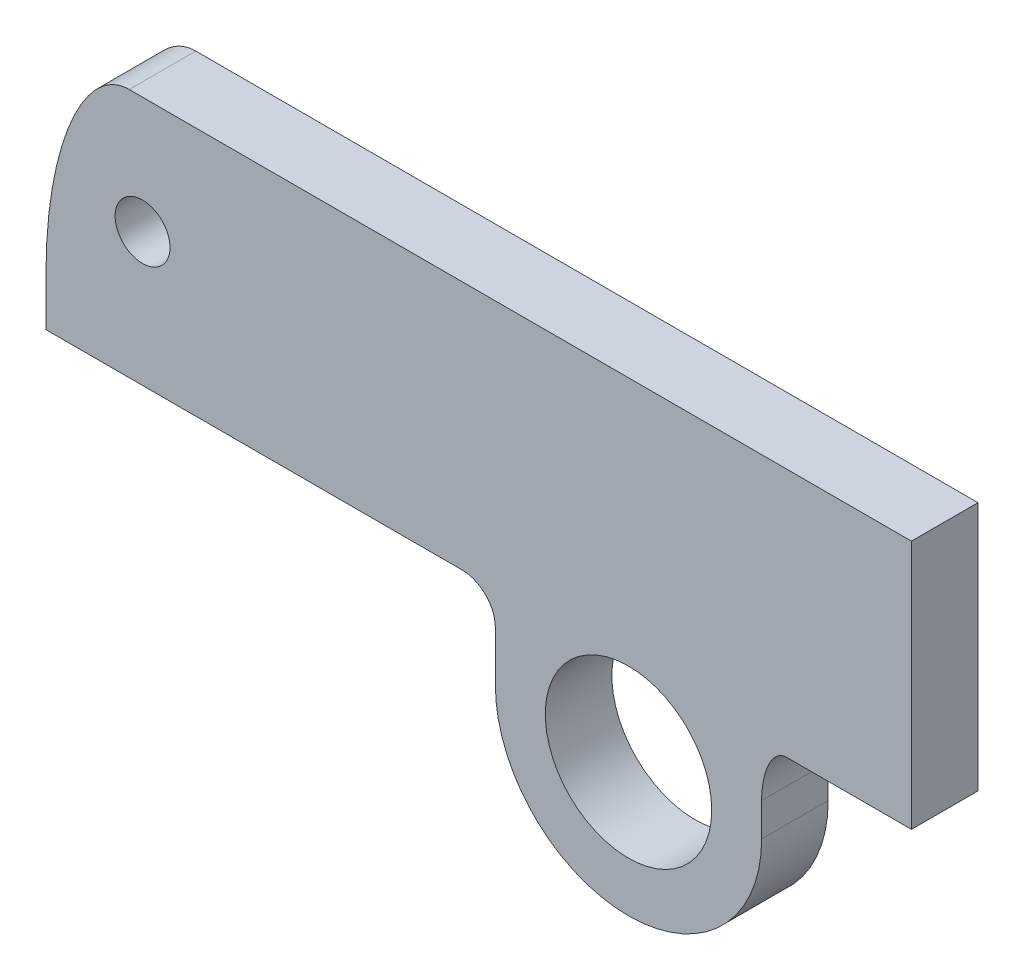
ISO-10303-21;
HEADER;
FILE_DESCRIPTION(('STEP AP214'),'2;1');
FILE_NAME('part.step','',(''),(''),'','','');
FILE_SCHEMA(('AUTOMOTIVE_DESIGN { 1 0 10303 214 1 1 1 1 }'));
ENDSEC;
DATA;
#1=APPLICATION_CONTEXT('core data for automotive mechanical design processes');
#2=APPLICATION_PROTOCOL_DEFINITION('international standard','automotive_design',2000,#1);
#3=PRODUCT_CONTEXT('',#1,'mechanical');
#4=PRODUCT('Part','Part','',(#3));
#5=PRODUCT_RELATED_PRODUCT_CATEGORY('part','',(#4));
#6=PRODUCT_DEFINITION_FORMATION('','',#4);
#7=PRODUCT_DEFINITION_CONTEXT('part definition',#1,'design');
#8=PRODUCT_DEFINITION('design','',#6,#7);
#9=PRODUCT_DEFINITION_SHAPE('','',#8);
#10=(LENGTH_UNIT() NAMED_UNIT(*) SI_UNIT(.MILLI.,.METRE.));
#11=(NAMED_UNIT(*) PLANE_ANGLE_UNIT() SI_UNIT($,.RADIAN.));
#12=(NAMED_UNIT(*) SI_UNIT($,.STERADIAN.) SOLID_ANGLE_UNIT());
#13=UNCERTAINTY_MEASURE_WITH_UNIT(LENGTH_MEASURE(1.E-05),#10,'distance_accuracy_value','');
#14=(GEOMETRIC_REPRESENTATION_CONTEXT(3) GLOBAL_UNCERTAINTY_ASSIGNED_CONTEXT((#13)) GLOBAL_UNIT_ASSIGNED_CONTEXT((#10,
#11,#12)) REPRESENTATION_CONTEXT('',''));
#15=CARTESIAN_POINT('',(0.,0.,0.));
#16=DIRECTION('',(0.,0.,1.));
#17=DIRECTION('',(1.,0.,0.));
#18=AXIS2_PLACEMENT_3D('',#15,#16,#17);
#19=CARTESIAN_POINT('',(25.,0.,4.));
#20=DIRECTION('',(-1.,0.,0.));
#21=DIRECTION('',(0.,-1.,0.));
#22=AXIS2_PLACEMENT_3D('',#19,#20,#21);
#23=PLANE('',#22);
#24=DIRECTION('',(0.,0.,1.));
#25=VECTOR('',#24,1.);
#26=CARTESIAN_POINT('',(25.,13.,-0.0249999999999998));
#27=LINE('',#26,#25);
#28=CARTESIAN_POINT('',(25.,13.,0.));
#29=VERTEX_POINT('',#28);
#30=CARTESIAN_POINT('',(25.,13.,4.));
#31=VERTEX_POINT('',#30);
#32=EDGE_CURVE('E152',#29,#31,#27,.T.);
#33=ORIENTED_EDGE('',*,*,#32,.F.);
#34=DIRECTION('',(0.,1.,0.));
#35=VECTOR('',#34,1.);
#36=CARTESIAN_POINT('',(25.,0.,0.));
#37=LINE('',#36,#35);
#38=CARTESIAN_POINT('',(25.,28.,0.));
#39=VERTEX_POINT('',#38);
#40=EDGE_CURVE('E495',#29,#39,#37,.T.);
#41=ORIENTED_EDGE('',*,*,#40,.T.);
#42=DIRECTION('',(0.,0.,-1.));
#43=VECTOR('',#42,1.);
#44=CARTESIAN_POINT('',(25.,28.,4.));
#45=LINE('',#44,#43);
#46=CARTESIAN_POINT('',(25.,28.,4.));
#47=VERTEX_POINT('',#46);
#48=EDGE_CURVE('E164',#47,#39,#45,.T.);
#49=ORIENTED_EDGE('',*,*,#48,.F.);
#50=DIRECTION('',(0.,1.,0.));
#51=VECTOR('',#50,1.);
#52=CARTESIAN_POINT('',(25.,0.,4.));
#53=LINE('',#52,#51);
#54=EDGE_CURVE('E149',#31,#47,#53,.T.);
#55=ORIENTED_EDGE('',*,*,#54,.F.);
#56=EDGE_LOOP('',(#33,#41,#49,#55));
#57=FACE_BOUND('',#56,.T.);
#58=ADVANCED_FACE('F50',(#57),#23,.F.);
#59=CARTESIAN_POINT('',(0.,0.,4.));
#60=DIRECTION('',(0.,0.,1.));
#61=DIRECTION('',(1.,0.,0.));
#62=AXIS2_PLACEMENT_3D('',#59,#60,#61);
#63=PLANE('',#62);
#64=CARTESIAN_POINT('',(8.,8.,4.));
#65=DIRECTION('',(0.,0.,1.));
#66=DIRECTION('',(1.,0.,0.));
#67=AXIS2_PLACEMENT_3D('',#64,#65,#66);
#68=CIRCLE('',#67,5.);
#69=CARTESIAN_POINT('',(13.,8.,4.));
#70=VERTEX_POINT('',#69);
#71=EDGE_CURVE('E340',#70,#70,#68,.T.);
#72=ORIENTED_EDGE('',*,*,#71,.F.);
#73=EDGE_LOOP('',(#72));
#74=FACE_BOUND('',#73,.T.);
#75=CARTESIAN_POINT('',(-21.2,21.,4.));
#76=DIRECTION('',(0.,0.,1.));
#77=DIRECTION('',(1.,0.,0.));
#78=AXIS2_PLACEMENT_3D('',#75,#76,#77);
#79=CIRCLE('',#78,1.65);
#80=CARTESIAN_POINT('',(-19.55,21.,4.));
#81=VERTEX_POINT('',#80);
#82=EDGE_CURVE('E344',#81,#81,#79,.T.);
#83=ORIENTED_EDGE('',*,*,#82,.F.);
#84=EDGE_LOOP('',(#83));
#85=FACE_BOUND('',#84,.T.);
#86=CARTESIAN_POINT('',(8.,8.,4.));
#87=DIRECTION('',(0.,0.,1.));
#88=DIRECTION('',(1.,0.,0.));
#89=AXIS2_PLACEMENT_3D('',#86,#87,#88);
#90=CIRCLE('',#89,8.);
#91=CARTESIAN_POINT('',(0.,8.,4.));
#92=VERTEX_POINT('',#91);
#93=CARTESIAN_POINT('',(8.,0.,4.));
#94=VERTEX_POINT('',#93);
#95=EDGE_CURVE('E444',#92,#94,#90,.T.);
#96=ORIENTED_EDGE('',*,*,#95,.T.);
#97=CARTESIAN_POINT('',(8.,8.,4.));
#98=DIRECTION('',(0.,0.,1.));
#99=DIRECTION('',(1.,0.,0.));
#100=AXIS2_PLACEMENT_3D('',#97,#98,#99);
#101=CIRCLE('',#100,8.);
#102=CARTESIAN_POINT('',(16.,8.,4.));
#103=VERTEX_POINT('',#102);
#104=EDGE_CURVE('E436',#94,#103,#101,.T.);
#105=ORIENTED_EDGE('',*,*,#104,.T.);
#106=DIRECTION('',(0.,1.,0.));
#107=VECTOR('',#106,1.);
#108=CARTESIAN_POINT('',(16.,0.,4.));
#109=LINE('',#108,#107);
#110=CARTESIAN_POINT('',(16.,9.99999999999999,4.));
#111=VERTEX_POINT('',#110);
#112=EDGE_CURVE('E153',#103,#111,#109,.T.);
#113=ORIENTED_EDGE('',*,*,#112,.T.);
#114=CARTESIAN_POINT('',(17.5,13.,4.));
#115=CARTESIAN_POINT('',(16.,13.,4.));
#116=CARTESIAN_POINT('',(16.,10.,4.));
#117=(BOUNDED_CURVE() B_SPLINE_CURVE(2,(#114,#115,#116),.UNSPECIFIED.,.F.,
.F.) B_SPLINE_CURVE_WITH_KNOTS((3,3),(0.,1.),
.UNSPECIFIED.) CURVE() GEOMETRIC_REPRESENTATION_ITEM() RATIONAL_B_SPLINE_CURVE((1.,
0.707106781186548,1.)) REPRESENTATION_ITEM(''));
#118=CARTESIAN_POINT('',(17.5,13.,4.));
#119=VERTEX_POINT('',#118);
#120=EDGE_CURVE('E65',#111,#119,#117,.F.);
#121=ORIENTED_EDGE('',*,*,#120,.T.);
#122=DIRECTION('',(1.,0.,0.));
#123=VECTOR('',#122,1.);
#124=CARTESIAN_POINT('',(16.,13.,4.));
#125=LINE('',#124,#123);
#126=EDGE_CURVE('E143',#119,#31,#125,.T.);
#127=ORIENTED_EDGE('',*,*,#126,.T.);
#128=ORIENTED_EDGE('',*,*,#54,.T.);
#129=DIRECTION('',(-1.,0.,0.));
#130=VECTOR('',#129,1.);
#131=CARTESIAN_POINT('',(-27.,28.,4.));
#132=LINE('',#131,#130);
#133=CARTESIAN_POINT('',(-22.,28.,4.));
#134=VERTEX_POINT('',#133);
#135=EDGE_CURVE('E167',#47,#134,#132,.T.);
#136=ORIENTED_EDGE('',*,*,#135,.T.);
#137=CARTESIAN_POINT('',(-27.,16.,4.));
#138=CARTESIAN_POINT('',(-27.,28.,4.));
#139=CARTESIAN_POINT('',(-22.,28.,4.));
#140=(BOUNDED_CURVE() B_SPLINE_CURVE(2,(#137,#138,#139),.UNSPECIFIED.,.F.,
.F.) B_SPLINE_CURVE_WITH_KNOTS((3,3),(0.,1.),
.UNSPECIFIED.) CURVE() GEOMETRIC_REPRESENTATION_ITEM() RATIONAL_B_SPLINE_CURVE((1.,
0.707106781186547,1.)) REPRESENTATION_ITEM(''));
#141=CARTESIAN_POINT('',(-27.,16.,4.));
#142=VERTEX_POINT('',#141);
#143=EDGE_CURVE('E308',#134,#142,#140,.F.);
#144=ORIENTED_EDGE('',*,*,#143,.T.);
#145=DIRECTION('',(0.,-1.,0.));
#146=VECTOR('',#145,1.);
#147=CARTESIAN_POINT('',(-27.,28.,4.));
#148=LINE('',#147,#146);
#149=CARTESIAN_POINT('',(-27.,13.,4.));
#150=VERTEX_POINT('',#149);
#151=EDGE_CURVE('E172',#142,#150,#148,.T.);
#152=ORIENTED_EDGE('',*,*,#151,.T.);
#153=DIRECTION('',(1.,0.,0.));
#154=VECTOR('',#153,1.);
#155=CARTESIAN_POINT('',(-27.,13.,4.));
#156=LINE('',#155,#154);
#157=CARTESIAN_POINT('',(-2.,13.,4.));
#158=VERTEX_POINT('',#157);
#159=EDGE_CURVE('E484',#150,#158,#156,.T.);
#160=ORIENTED_EDGE('',*,*,#159,.T.);
#161=CARTESIAN_POINT('',(-2.,11.,4.));
#162=DIRECTION('',(0.,0.,1.));
#163=DIRECTION('',(1.,0.,0.));
#164=AXIS2_PLACEMENT_3D('',#161,#162,#163);
#165=CIRCLE('',#164,2.);
#166=CARTESIAN_POINT('',(0.,11.,4.));
#167=VERTEX_POINT('',#166);
#168=EDGE_CURVE('E314',#158,#167,#165,.F.);
#169=ORIENTED_EDGE('',*,*,#168,.T.);
#170=DIRECTION('',(0.,-1.,0.));
#171=VECTOR('',#170,1.);
#172=CARTESIAN_POINT('',(0.,13.,4.));
#173=LINE('',#172,#171);
#174=EDGE_CURVE('E168',#167,#92,#173,.T.);
#175=ORIENTED_EDGE('',*,*,#174,.T.);
#176=EDGE_LOOP('',(#96,#105,#113,#121,#127,#128,#136,#144,#152,#160,#169,#175));
#177=FACE_BOUND('',#176,.T.);
#178=ADVANCED_FACE('F146',(#74,#85,#177),#63,.T.);
#179=CARTESIAN_POINT('',(0.,0.,0.));
#180=DIRECTION('',(0.,0.,1.));
#181=DIRECTION('',(1.,0.,0.));
#182=AXIS2_PLACEMENT_3D('',#179,#180,#181);
#183=PLANE('',#182);
#184=CARTESIAN_POINT('',(-21.2,21.,0.));
#185=DIRECTION('',(0.,0.,1.));
#186=DIRECTION('',(1.,0.,0.));
#187=AXIS2_PLACEMENT_3D('',#184,#185,#186);
#188=CIRCLE('',#187,1.65);
#189=CARTESIAN_POINT('',(-19.55,21.,0.));
#190=VERTEX_POINT('',#189);
#191=EDGE_CURVE('E161',#190,#190,#188,.T.);
#192=ORIENTED_EDGE('',*,*,#191,.T.);
#193=EDGE_LOOP('',(#192));
#194=FACE_BOUND('',#193,.T.);
#195=CARTESIAN_POINT('',(8.,8.,0.));
#196=DIRECTION('',(0.,0.,1.));
#197=DIRECTION('',(1.,0.,0.));
#198=AXIS2_PLACEMENT_3D('',#195,#196,#197);
#199=CIRCLE('',#198,5.);
#200=CARTESIAN_POINT('',(13.,8.,0.));
#201=VERTEX_POINT('',#200);
#202=EDGE_CURVE('E335',#201,#201,#199,.T.);
#203=ORIENTED_EDGE('',*,*,#202,.T.);
#204=EDGE_LOOP('',(#203));
#205=FACE_BOUND('',#204,.T.);
#206=DIRECTION('',(0.,1.,0.));
#207=VECTOR('',#206,1.);
#208=CARTESIAN_POINT('',(16.,0.,0.));
#209=LINE('',#208,#207);
#210=CARTESIAN_POINT('',(16.,8.,0.));
#211=VERTEX_POINT('',#210);
#212=CARTESIAN_POINT('',(16.,10.,0.));
#213=VERTEX_POINT('',#212);
#214=EDGE_CURVE('E324',#211,#213,#209,.T.);
#215=ORIENTED_EDGE('',*,*,#214,.F.);
#216=CARTESIAN_POINT('',(8.,8.,0.));
#217=DIRECTION('',(0.,0.,1.));
#218=DIRECTION('',(1.,0.,0.));
#219=AXIS2_PLACEMENT_3D('',#216,#217,#218);
#220=CIRCLE('',#219,8.);
#221=CARTESIAN_POINT('',(8.,0.,0.));
#222=VERTEX_POINT('',#221);
#223=EDGE_CURVE('E426',#211,#222,#220,.F.);
#224=ORIENTED_EDGE('',*,*,#223,.T.);
#225=CARTESIAN_POINT('',(8.,8.,0.));
#226=DIRECTION('',(0.,0.,1.));
#227=DIRECTION('',(1.,0.,0.));
#228=AXIS2_PLACEMENT_3D('',#225,#226,#227);
#229=CIRCLE('',#228,8.);
#230=CARTESIAN_POINT('',(0.,8.,0.));
#231=VERTEX_POINT('',#230);
#232=EDGE_CURVE('E453',#222,#231,#229,.F.);
#233=ORIENTED_EDGE('',*,*,#232,.T.);
#234=DIRECTION('',(0.,-1.,0.));
#235=VECTOR('',#234,1.);
#236=CARTESIAN_POINT('',(0.,13.,0.));
#237=LINE('',#236,#235);
#238=CARTESIAN_POINT('',(0.,11.,0.));
#239=VERTEX_POINT('',#238);
#240=EDGE_CURVE('E339',#239,#231,#237,.T.);
#241=ORIENTED_EDGE('',*,*,#240,.F.);
#242=CARTESIAN_POINT('',(-2.,11.,0.));
#243=DIRECTION('',(0.,0.,1.));
#244=DIRECTION('',(1.,0.,0.));
#245=AXIS2_PLACEMENT_3D('',#242,#243,#244);
#246=CIRCLE('',#245,2.);
#247=CARTESIAN_POINT('',(-2.,13.,0.));
#248=VERTEX_POINT('',#247);
#249=EDGE_CURVE('E311',#239,#248,#246,.T.);
#250=ORIENTED_EDGE('',*,*,#249,.T.);
#251=DIRECTION('',(1.,0.,0.));
#252=VECTOR('',#251,1.);
#253=CARTESIAN_POINT('',(-27.,13.,0.));
#254=LINE('',#253,#252);
#255=CARTESIAN_POINT('',(-27.,13.,0.));
#256=VERTEX_POINT('',#255);
#257=EDGE_CURVE('E174',#256,#248,#254,.T.);
#258=ORIENTED_EDGE('',*,*,#257,.F.);
#259=DIRECTION('',(0.,-1.,0.));
#260=VECTOR('',#259,1.);
#261=CARTESIAN_POINT('',(-27.,28.,0.));
#262=LINE('',#261,#260);
#263=CARTESIAN_POINT('',(-27.,16.,0.));
#264=VERTEX_POINT('',#263);
#265=EDGE_CURVE('E469',#264,#256,#262,.T.);
#266=ORIENTED_EDGE('',*,*,#265,.F.);
#267=CARTESIAN_POINT('',(-22.,28.,0.));
#268=CARTESIAN_POINT('',(-27.,28.,0.));
#269=CARTESIAN_POINT('',(-27.,16.,0.));
#270=(BOUNDED_CURVE() B_SPLINE_CURVE(2,(#267,#268,#269),.UNSPECIFIED.,.F.,
.F.) B_SPLINE_CURVE_WITH_KNOTS((3,3),(0.,1.),
.UNSPECIFIED.) CURVE() GEOMETRIC_REPRESENTATION_ITEM() RATIONAL_B_SPLINE_CURVE((1.,
0.707106781186547,1.)) REPRESENTATION_ITEM(''));
#271=CARTESIAN_POINT('',(-22.,28.,0.));
#272=VERTEX_POINT('',#271);
#273=EDGE_CURVE('E504',#264,#272,#270,.F.);
#274=ORIENTED_EDGE('',*,*,#273,.T.);
#275=DIRECTION('',(-1.,0.,0.));
#276=VECTOR('',#275,1.);
#277=CARTESIAN_POINT('',(-27.,28.,0.));
#278=LINE('',#277,#276);
#279=EDGE_CURVE('E473',#39,#272,#278,.T.);
#280=ORIENTED_EDGE('',*,*,#279,.F.);
#281=ORIENTED_EDGE('',*,*,#40,.F.);
#282=DIRECTION('',(1.,0.,0.));
#283=VECTOR('',#282,1.);
#284=CARTESIAN_POINT('',(0.,13.,0.));
#285=LINE('',#284,#283);
#286=CARTESIAN_POINT('',(17.5,13.,0.));
#287=VERTEX_POINT('',#286);
#288=EDGE_CURVE('E157',#287,#29,#285,.T.);
#289=ORIENTED_EDGE('',*,*,#288,.F.);
#290=CARTESIAN_POINT('',(16.,10.,0.));
#291=CARTESIAN_POINT('',(16.,13.,0.));
#292=CARTESIAN_POINT('',(17.5,13.,0.));
#293=(BOUNDED_CURVE() B_SPLINE_CURVE(2,(#290,#291,#292),.UNSPECIFIED.,.F.,
.F.) B_SPLINE_CURVE_WITH_KNOTS((3,3),(0.,1.),
.UNSPECIFIED.) CURVE() GEOMETRIC_REPRESENTATION_ITEM() RATIONAL_B_SPLINE_CURVE((1.,
0.707106781186548,1.)) REPRESENTATION_ITEM(''));
#294=EDGE_CURVE('E12',#287,#213,#293,.F.);
#295=ORIENTED_EDGE('',*,*,#294,.T.);
#296=EDGE_LOOP('',(#215,#224,#233,#241,#250,#258,#266,#274,#280,#281,#289,#295));
#297=FACE_BOUND('',#296,.T.);
#298=ADVANCED_FACE('F216',(#194,#205,#297),#183,.F.);
#299=CARTESIAN_POINT('',(0.,13.,4.));
#300=DIRECTION('',(1.,0.,0.));
#301=DIRECTION('',(0.,0.,-1.));
#302=AXIS2_PLACEMENT_3D('',#299,#300,#301);
#303=PLANE('',#302);
#304=ORIENTED_EDGE('',*,*,#174,.F.);
#305=DIRECTION('',(0.,0.,-1.));
#306=VECTOR('',#305,1.);
#307=CARTESIAN_POINT('',(0.,11.,0.));
#308=LINE('',#307,#306);
#309=EDGE_CURVE('E298',#167,#239,#308,.T.);
#310=ORIENTED_EDGE('',*,*,#309,.T.);
#311=ORIENTED_EDGE('',*,*,#240,.T.);
#312=DIRECTION('',(0.,0.,-1.));
#313=VECTOR('',#312,1.);
#314=CARTESIAN_POINT('',(0.,8.,4.));
#315=LINE('',#314,#313);
#316=EDGE_CURVE('E457',#231,#92,#315,.F.);
#317=ORIENTED_EDGE('',*,*,#316,.T.);
#318=EDGE_LOOP('',(#304,#310,#311,#317));
#319=FACE_BOUND('',#318,.T.);
#320=ADVANCED_FACE('F209',(#319),#303,.F.);
#321=CARTESIAN_POINT('',(-27.,28.,4.));
#322=DIRECTION('',(0.,-1.,0.));
#323=DIRECTION('',(0.,0.,-1.));
#324=AXIS2_PLACEMENT_3D('',#321,#322,#323);
#325=PLANE('',#324);
#326=ORIENTED_EDGE('',*,*,#279,.T.);
#327=CARTESIAN_POINT('',(-22.,28.,4.2));
#328=CARTESIAN_POINT('',(-22.,28.,2.73333333333333));
#329=CARTESIAN_POINT('',(-22.,28.,1.26666666666667));
#330=CARTESIAN_POINT('',(-22.,28.,-0.200000000000001));
#331=(BOUNDED_CURVE() B_SPLINE_CURVE(3,(#327,#328,#329,#330),.UNSPECIFIED.,.F.,
.F.) B_SPLINE_CURVE_WITH_KNOTS((4,4),(-0.0002,0.0042),
.UNSPECIFIED.) CURVE() GEOMETRIC_REPRESENTATION_ITEM() RATIONAL_B_SPLINE_CURVE((1.,1.,1.,1.)) REPRESENTATION_ITEM(''));
#332=EDGE_CURVE('E192',#272,#134,#331,.F.);
#333=ORIENTED_EDGE('',*,*,#332,.T.);
#334=ORIENTED_EDGE('',*,*,#135,.F.);
#335=ORIENTED_EDGE('',*,*,#48,.T.);
#336=EDGE_LOOP('',(#326,#333,#334,#335));
#337=FACE_BOUND('',#336,.T.);
#338=ADVANCED_FACE('F198',(#337),#325,.F.);
#339=CARTESIAN_POINT('',(-27.,28.,4.));
#340=DIRECTION('',(1.,0.,0.));
#341=DIRECTION('',(0.,1.,0.));
#342=AXIS2_PLACEMENT_3D('',#339,#340,#341);
#343=PLANE('',#342);
#344=ORIENTED_EDGE('',*,*,#151,.F.);
#345=CARTESIAN_POINT('',(-27.,16.,-0.200000000000001));
#346=CARTESIAN_POINT('',(-27.,16.,1.26666666666667));
#347=CARTESIAN_POINT('',(-27.,16.,2.73333333333333));
#348=CARTESIAN_POINT('',(-27.,16.,4.2));
#349=(BOUNDED_CURVE() B_SPLINE_CURVE(3,(#345,#346,#347,#348),.UNSPECIFIED.,.F.,
.F.) B_SPLINE_CURVE_WITH_KNOTS((4,4),(-0.0002,0.0042),
.UNSPECIFIED.) CURVE() GEOMETRIC_REPRESENTATION_ITEM() RATIONAL_B_SPLINE_CURVE((1.,1.,1.,1.)) REPRESENTATION_ITEM(''));
#350=EDGE_CURVE('E468',#142,#264,#349,.F.);
#351=ORIENTED_EDGE('',*,*,#350,.T.);
#352=ORIENTED_EDGE('',*,*,#265,.T.);
#353=DIRECTION('',(0.,0.,-1.));
#354=VECTOR('',#353,1.);
#355=CARTESIAN_POINT('',(-27.,13.,4.));
#356=LINE('',#355,#354);
#357=EDGE_CURVE('E459',#150,#256,#356,.T.);
#358=ORIENTED_EDGE('',*,*,#357,.F.);
#359=EDGE_LOOP('',(#344,#351,#352,#358));
#360=FACE_BOUND('',#359,.T.);
#361=ADVANCED_FACE('F208',(#360),#343,.F.);
#362=CARTESIAN_POINT('',(-27.,13.,4.));
#363=DIRECTION('',(0.,1.,0.));
#364=DIRECTION('',(0.,0.,1.));
#365=AXIS2_PLACEMENT_3D('',#362,#363,#364);
#366=PLANE('',#365);
#367=ORIENTED_EDGE('',*,*,#257,.T.);
#368=DIRECTION('',(0.,0.,-1.));
#369=VECTOR('',#368,1.);
#370=CARTESIAN_POINT('',(-2.,13.,4.));
#371=LINE('',#370,#369);
#372=EDGE_CURVE('E307',#248,#158,#371,.F.);
#373=ORIENTED_EDGE('',*,*,#372,.T.);
#374=ORIENTED_EDGE('',*,*,#159,.F.);
#375=ORIENTED_EDGE('',*,*,#357,.T.);
#376=EDGE_LOOP('',(#367,#373,#374,#375));
#377=FACE_BOUND('',#376,.T.);
#378=ADVANCED_FACE('F222',(#377),#366,.F.);
#379=CARTESIAN_POINT('',(8.,8.,4.));
#380=DIRECTION('',(0.,0.,-1.));
#381=DIRECTION('',(-1.,0.,0.));
#382=AXIS2_PLACEMENT_3D('',#379,#380,#381);
#383=CYLINDRICAL_SURFACE('',#382,8.);
#384=ORIENTED_EDGE('',*,*,#95,.F.);
#385=ORIENTED_EDGE('',*,*,#316,.F.);
#386=ORIENTED_EDGE('',*,*,#232,.F.);
#387=DIRECTION('',(0.,0.,-1.));
#388=VECTOR('',#387,1.);
#389=CARTESIAN_POINT('',(8.,0.,4.));
#390=LINE('',#389,#388);
#391=EDGE_CURVE('E451',#94,#222,#390,.T.);
#392=ORIENTED_EDGE('',*,*,#391,.F.);
#393=EDGE_LOOP('',(#384,#385,#386,#392));
#394=FACE_BOUND('',#393,.T.);
#395=ADVANCED_FACE('F218',(#394),#383,.T.);
#396=CARTESIAN_POINT('',(-21.2,21.,0.));
#397=DIRECTION('',(0.,0.,1.));
#398=DIRECTION('',(1.,0.,0.));
#399=AXIS2_PLACEMENT_3D('',#396,#397,#398);
#400=CYLINDRICAL_SURFACE('',#399,1.65);
#401=ORIENTED_EDGE('',*,*,#191,.F.);
#402=EDGE_LOOP('',(#401));
#403=FACE_BOUND('',#402,.T.);
#404=ORIENTED_EDGE('',*,*,#82,.T.);
#405=EDGE_LOOP('',(#404));
#406=FACE_BOUND('',#405,.T.);
#407=ADVANCED_FACE('F221',(#403,#406),#400,.F.);
#408=CARTESIAN_POINT('',(8.,8.,0.));
#409=DIRECTION('',(0.,0.,1.));
#410=DIRECTION('',(1.,0.,0.));
#411=AXIS2_PLACEMENT_3D('',#408,#409,#410);
#412=CYLINDRICAL_SURFACE('',#411,5.);
#413=ORIENTED_EDGE('',*,*,#202,.F.);
#414=EDGE_LOOP('',(#413));
#415=FACE_BOUND('',#414,.T.);
#416=ORIENTED_EDGE('',*,*,#71,.T.);
#417=EDGE_LOOP('',(#416));
#418=FACE_BOUND('',#417,.T.);
#419=ADVANCED_FACE('F234',(#415,#418),#412,.F.);
#420=CARTESIAN_POINT('',(-27.,16.,4.2));
#421=CARTESIAN_POINT('',(-27.,16.,2.73333333333333));
#422=CARTESIAN_POINT('',(-27.,16.,1.26666666666667));
#423=CARTESIAN_POINT('',(-27.,16.,-0.200000000000001));
#424=CARTESIAN_POINT('',(-27.,28.,4.2));
#425=CARTESIAN_POINT('',(-27.,28.,2.73333333333333));
#426=CARTESIAN_POINT('',(-27.,28.,1.26666666666667));
#427=CARTESIAN_POINT('',(-27.,28.,-0.200000000000001));
#428=CARTESIAN_POINT('',(-22.,28.,4.2));
#429=CARTESIAN_POINT('',(-22.,28.,2.73333333333333));
#430=CARTESIAN_POINT('',(-22.,28.,1.26666666666667));
#431=CARTESIAN_POINT('',(-22.,28.,-0.200000000000001));
#432=(BOUNDED_SURFACE() B_SPLINE_SURFACE(2,3,((#420,#421,#422,#423),(#424,#425,#426,#427),(#428,
#429,#430,#431)),.UNSPECIFIED.,.F.,.F.,.F.) B_SPLINE_SURFACE_WITH_KNOTS((3,3),(4,4),(0.,1.),
(-0.0002,0.0042),.UNSPECIFIED.) GEOMETRIC_REPRESENTATION_ITEM() RATIONAL_B_SPLINE_SURFACE(((1.,
1.,1.,1.),(0.707106781186547,0.707106781186547,0.707106781186547,0.707106781186547),(1.,1.,1.,1.))) REPRESENTATION_ITEM('') SURFACE());
#433=ORIENTED_EDGE('',*,*,#143,.F.);
#434=ORIENTED_EDGE('',*,*,#332,.F.);
#435=ORIENTED_EDGE('',*,*,#273,.F.);
#436=ORIENTED_EDGE('',*,*,#350,.F.);
#437=EDGE_LOOP('',(#433,#434,#435,#436));
#438=FACE_BOUND('',#437,.T.);
#439=ADVANCED_FACE('F225',(#438),#432,.T.);
#440=CARTESIAN_POINT('',(-2.,11.,4.));
#441=DIRECTION('',(0.,0.,1.));
#442=DIRECTION('',(1.,0.,0.));
#443=AXIS2_PLACEMENT_3D('',#440,#441,#442);
#444=CYLINDRICAL_SURFACE('',#443,2.);
#445=ORIENTED_EDGE('',*,*,#168,.F.);
#446=ORIENTED_EDGE('',*,*,#372,.F.);
#447=ORIENTED_EDGE('',*,*,#249,.F.);
#448=ORIENTED_EDGE('',*,*,#309,.F.);
#449=EDGE_LOOP('',(#445,#446,#447,#448));
#450=FACE_BOUND('',#449,.T.);
#451=ADVANCED_FACE('F233',(#450),#444,.F.);
#452=CARTESIAN_POINT('',(16.,0.,-0.0249999999999998));
#453=DIRECTION('',(1.,0.,0.));
#454=DIRECTION('',(0.,0.,-1.));
#455=AXIS2_PLACEMENT_3D('',#452,#453,#454);
#456=PLANE('',#455);
#457=ORIENTED_EDGE('',*,*,#214,.T.);
#458=CARTESIAN_POINT('',(16.,10.,4.2));
#459=CARTESIAN_POINT('',(16.,10.,2.73333333333333));
#460=CARTESIAN_POINT('',(16.,10.,1.26666666666667));
#461=CARTESIAN_POINT('',(16.,10.,-0.200000000000001));
#462=(BOUNDED_CURVE() B_SPLINE_CURVE(3,(#458,#459,#460,#461),.UNSPECIFIED.,.F.,
.F.) B_SPLINE_CURVE_WITH_KNOTS((4,4),(-0.004225,0.000175),
.UNSPECIFIED.) CURVE() GEOMETRIC_REPRESENTATION_ITEM() RATIONAL_B_SPLINE_CURVE((1.,1.,1.,1.)) REPRESENTATION_ITEM(''));
#463=EDGE_CURVE('E406',#213,#111,#462,.F.);
#464=ORIENTED_EDGE('',*,*,#463,.T.);
#465=ORIENTED_EDGE('',*,*,#112,.F.);
#466=DIRECTION('',(0.,0.,1.));
#467=VECTOR('',#466,1.);
#468=CARTESIAN_POINT('',(16.,8.,0.));
#469=LINE('',#468,#467);
#470=EDGE_CURVE('E430',#103,#211,#469,.F.);
#471=ORIENTED_EDGE('',*,*,#470,.T.);
#472=EDGE_LOOP('',(#457,#464,#465,#471));
#473=FACE_BOUND('',#472,.T.);
#474=ADVANCED_FACE('F449',(#473),#456,.T.);
#475=CARTESIAN_POINT('',(16.,13.,-0.0249999999999998));
#476=DIRECTION('',(0.,-1.,0.));
#477=DIRECTION('',(0.,0.,-1.));
#478=AXIS2_PLACEMENT_3D('',#475,#476,#477);
#479=PLANE('',#478);
#480=ORIENTED_EDGE('',*,*,#126,.F.);
#481=CARTESIAN_POINT('',(17.5,13.,-0.200000000000001));
#482=CARTESIAN_POINT('',(17.5,13.,1.26666666666667));
#483=CARTESIAN_POINT('',(17.5,13.,2.73333333333333));
#484=CARTESIAN_POINT('',(17.5,13.,4.2));
#485=(BOUNDED_CURVE() B_SPLINE_CURVE(3,(#481,#482,#483,#484),.UNSPECIFIED.,.F.,
.F.) B_SPLINE_CURVE_WITH_KNOTS((4,4),(-0.004225,0.000175),
.UNSPECIFIED.) CURVE() GEOMETRIC_REPRESENTATION_ITEM() RATIONAL_B_SPLINE_CURVE((1.,1.,1.,1.)) REPRESENTATION_ITEM(''));
#486=EDGE_CURVE('E79',#119,#287,#485,.F.);
#487=ORIENTED_EDGE('',*,*,#486,.T.);
#488=ORIENTED_EDGE('',*,*,#288,.T.);
#489=ORIENTED_EDGE('',*,*,#32,.T.);
#490=EDGE_LOOP('',(#480,#487,#488,#489));
#491=FACE_BOUND('',#490,.T.);
#492=ADVANCED_FACE('F156',(#491),#479,.T.);
#493=CARTESIAN_POINT('',(8.,8.,4.));
#494=DIRECTION('',(0.,0.,-1.));
#495=DIRECTION('',(-1.,0.,0.));
#496=AXIS2_PLACEMENT_3D('',#493,#494,#495);
#497=CYLINDRICAL_SURFACE('',#496,8.);
#498=ORIENTED_EDGE('',*,*,#223,.F.);
#499=ORIENTED_EDGE('',*,*,#470,.F.);
#500=ORIENTED_EDGE('',*,*,#104,.F.);
#501=ORIENTED_EDGE('',*,*,#391,.T.);
#502=EDGE_LOOP('',(#498,#499,#500,#501));
#503=FACE_BOUND('',#502,.T.);
#504=ADVANCED_FACE('F450',(#503),#497,.T.);
#505=CARTESIAN_POINT('',(17.5,13.,4.2));
#506=CARTESIAN_POINT('',(17.5,13.,2.73333333333333));
#507=CARTESIAN_POINT('',(17.5,13.,1.26666666666667));
#508=CARTESIAN_POINT('',(17.5,13.,-0.200000000000001));
#509=CARTESIAN_POINT('',(16.,13.,4.2));
#510=CARTESIAN_POINT('',(16.,13.,2.73333333333333));
#511=CARTESIAN_POINT('',(16.,13.,1.26666666666667));
#512=CARTESIAN_POINT('',(16.,13.,-0.200000000000001));
#513=CARTESIAN_POINT('',(16.,10.,4.2));
#514=CARTESIAN_POINT('',(16.,10.,2.73333333333333));
#515=CARTESIAN_POINT('',(16.,10.,1.26666666666667));
#516=CARTESIAN_POINT('',(16.,10.,-0.200000000000001));
#517=(BOUNDED_SURFACE() B_SPLINE_SURFACE(2,3,((#505,#506,#507,#508),(#509,#510,#511,#512),(#513,
#514,#515,#516)),.UNSPECIFIED.,.F.,.F.,.F.) B_SPLINE_SURFACE_WITH_KNOTS((3,3),(4,4),(0.,1.),
(-0.004225,0.000175),
.UNSPECIFIED.) GEOMETRIC_REPRESENTATION_ITEM() RATIONAL_B_SPLINE_SURFACE(((1.,1.,1.,1.),
(0.707106781186548,0.707106781186548,0.707106781186548,0.707106781186548),(1.,1.,1.,1.))) REPRESENTATION_ITEM('') SURFACE());
#518=ORIENTED_EDGE('',*,*,#294,.F.);
#519=ORIENTED_EDGE('',*,*,#486,.F.);
#520=ORIENTED_EDGE('',*,*,#120,.F.);
#521=ORIENTED_EDGE('',*,*,#463,.F.);
#522=EDGE_LOOP('',(#518,#519,#520,#521));
#523=FACE_BOUND('',#522,.T.);
#524=ADVANCED_FACE('F53',(#523),#517,.T.);
#525=CLOSED_SHELL('',(#58,#178,#298,#320,#338,#361,#378,#395,#407,#419,#439,#451,#474,#492,#504,#524));
#526=MANIFOLD_SOLID_BREP('B2',#525);
#527=ADVANCED_BREP_SHAPE_REPRESENTATION('',(#18,#526),#14);
#528=SHAPE_DEFINITION_REPRESENTATION(#9,#527);
ENDSEC;
END-ISO-10303-21;
